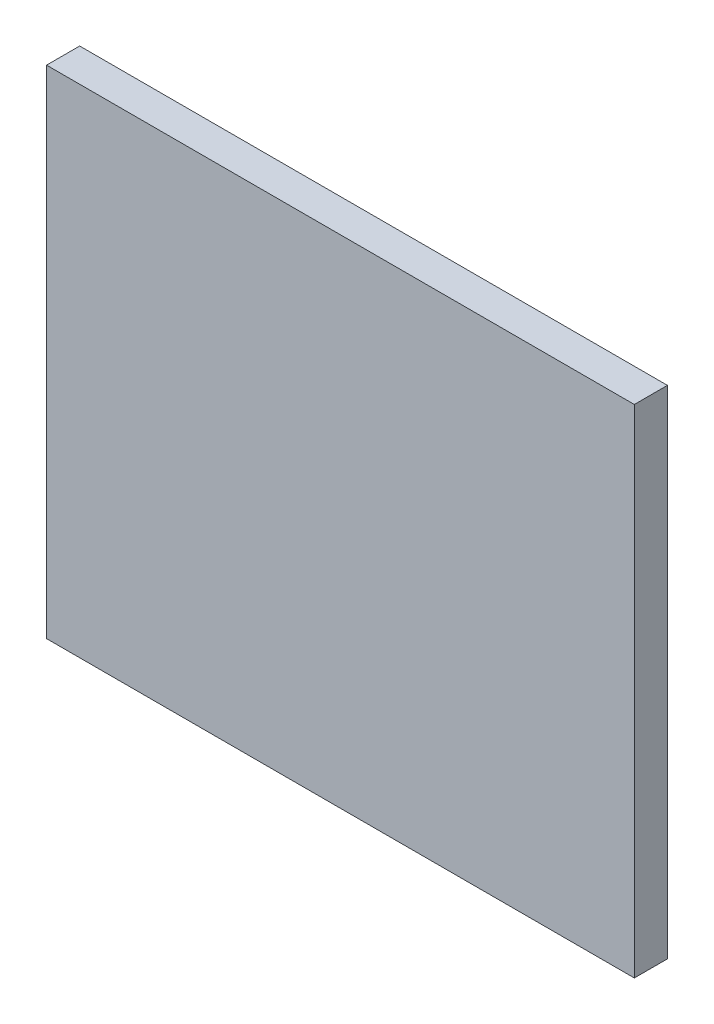
ISO-10303-21;
HEADER;
FILE_DESCRIPTION(('STEP AP214'),'2;1');
FILE_NAME('part.step','',(''),(''),'','','');
FILE_SCHEMA(('AUTOMOTIVE_DESIGN { 1 0 10303 214 1 1 1 1 }'));
ENDSEC;
DATA;
#1=APPLICATION_CONTEXT('core data for automotive mechanical design processes');
#2=APPLICATION_PROTOCOL_DEFINITION('international standard','automotive_design',2000,#1);
#3=PRODUCT_CONTEXT('',#1,'mechanical');
#4=PRODUCT('Part','Part','',(#3));
#5=PRODUCT_RELATED_PRODUCT_CATEGORY('part','',(#4));
#6=PRODUCT_DEFINITION_FORMATION('','',#4);
#7=PRODUCT_DEFINITION_CONTEXT('part definition',#1,'design');
#8=PRODUCT_DEFINITION('design','',#6,#7);
#9=PRODUCT_DEFINITION_SHAPE('','',#8);
#10=(LENGTH_UNIT() NAMED_UNIT(*) SI_UNIT(.MILLI.,.METRE.));
#11=(NAMED_UNIT(*) PLANE_ANGLE_UNIT() SI_UNIT($,.RADIAN.));
#12=(NAMED_UNIT(*) SI_UNIT($,.STERADIAN.) SOLID_ANGLE_UNIT());
#13=UNCERTAINTY_MEASURE_WITH_UNIT(LENGTH_MEASURE(1.E-05),#10,'distance_accuracy_value','');
#14=(GEOMETRIC_REPRESENTATION_CONTEXT(3) GLOBAL_UNCERTAINTY_ASSIGNED_CONTEXT((#13)) GLOBAL_UNIT_ASSIGNED_CONTEXT((#10,
#11,#12)) REPRESENTATION_CONTEXT('',''));
#15=CARTESIAN_POINT('',(0.,0.,0.));
#16=DIRECTION('',(0.,0.,1.));
#17=DIRECTION('',(1.,0.,0.));
#18=AXIS2_PLACEMENT_3D('',#15,#16,#17);
#19=CARTESIAN_POINT('',(0.,60.,0.));
#20=DIRECTION('',(1.,0.,0.));
#21=DIRECTION('',(0.,0.,-1.));
#22=AXIS2_PLACEMENT_3D('',#19,#20,#21);
#23=PLANE('',#22);
#24=DIRECTION('',(0.,0.,1.));
#25=VECTOR('',#24,1.);
#26=CARTESIAN_POINT('',(0.,0.,0.));
#27=LINE('',#26,#25);
#28=CARTESIAN_POINT('',(0.,0.,-4.));
#29=VERTEX_POINT('',#28);
#30=CARTESIAN_POINT('',(0.,0.,0.));
#31=VERTEX_POINT('',#30);
#32=EDGE_CURVE('E96',#29,#31,#27,.T.);
#33=ORIENTED_EDGE('',*,*,#32,.T.);
#34=DIRECTION('',(0.,-1.,0.));
#35=VECTOR('',#34,1.);
#36=CARTESIAN_POINT('',(0.,60.,0.));
#37=LINE('',#36,#35);
#38=CARTESIAN_POINT('',(0.,60.,0.));
#39=VERTEX_POINT('',#38);
#40=EDGE_CURVE('E11',#39,#31,#37,.T.);
#41=ORIENTED_EDGE('',*,*,#40,.F.);
#42=DIRECTION('',(0.,0.,1.));
#43=VECTOR('',#42,1.);
#44=CARTESIAN_POINT('',(0.,60.,0.));
#45=LINE('',#44,#43);
#46=CARTESIAN_POINT('',(0.,60.,-4.));
#47=VERTEX_POINT('',#46);
#48=EDGE_CURVE('E84',#47,#39,#45,.T.);
#49=ORIENTED_EDGE('',*,*,#48,.F.);
#50=DIRECTION('',(0.,-1.,0.));
#51=VECTOR('',#50,1.);
#52=CARTESIAN_POINT('',(0.,60.,-4.));
#53=LINE('',#52,#51);
#54=EDGE_CURVE('E92',#47,#29,#53,.T.);
#55=ORIENTED_EDGE('',*,*,#54,.T.);
#56=EDGE_LOOP('',(#33,#41,#49,#55));
#57=FACE_BOUND('',#56,.T.);
#58=ADVANCED_FACE('F33',(#57),#23,.F.);
#59=CARTESIAN_POINT('',(0.,60.,0.));
#60=DIRECTION('',(0.,0.,-1.));
#61=DIRECTION('',(-1.,0.,0.));
#62=AXIS2_PLACEMENT_3D('',#59,#60,#61);
#63=PLANE('',#62);
#64=DIRECTION('',(1.,0.,0.));
#65=VECTOR('',#64,1.);
#66=CARTESIAN_POINT('',(0.,0.,0.));
#67=LINE('',#66,#65);
#68=CARTESIAN_POINT('',(71.,0.,0.));
#69=VERTEX_POINT('',#68);
#70=EDGE_CURVE('E88',#31,#69,#67,.T.);
#71=ORIENTED_EDGE('',*,*,#70,.T.);
#72=DIRECTION('',(0.,-1.,0.));
#73=VECTOR('',#72,1.);
#74=CARTESIAN_POINT('',(71.,60.,0.));
#75=LINE('',#74,#73);
#76=CARTESIAN_POINT('',(71.,60.,0.));
#77=VERTEX_POINT('',#76);
#78=EDGE_CURVE('E41',#77,#69,#75,.T.);
#79=ORIENTED_EDGE('',*,*,#78,.F.);
#80=DIRECTION('',(1.,0.,0.));
#81=VECTOR('',#80,1.);
#82=CARTESIAN_POINT('',(0.,60.,0.));
#83=LINE('',#82,#81);
#84=EDGE_CURVE('E79',#39,#77,#83,.T.);
#85=ORIENTED_EDGE('',*,*,#84,.F.);
#86=ORIENTED_EDGE('',*,*,#40,.T.);
#87=EDGE_LOOP('',(#71,#79,#85,#86));
#88=FACE_BOUND('',#87,.T.);
#89=ADVANCED_FACE('F87',(#88),#63,.F.);
#90=CARTESIAN_POINT('',(71.,60.,0.));
#91=DIRECTION('',(-1.,0.,0.));
#92=DIRECTION('',(0.,0.,1.));
#93=AXIS2_PLACEMENT_3D('',#90,#91,#92);
#94=PLANE('',#93);
#95=DIRECTION('',(0.,0.,-1.));
#96=VECTOR('',#95,1.);
#97=CARTESIAN_POINT('',(71.,0.,0.));
#98=LINE('',#97,#96);
#99=CARTESIAN_POINT('',(71.,0.,-4.));
#100=VERTEX_POINT('',#99);
#101=EDGE_CURVE('E66',#69,#100,#98,.T.);
#102=ORIENTED_EDGE('',*,*,#101,.T.);
#103=DIRECTION('',(0.,-1.,0.));
#104=VECTOR('',#103,1.);
#105=CARTESIAN_POINT('',(71.,60.,-4.));
#106=LINE('',#105,#104);
#107=CARTESIAN_POINT('',(71.,60.,-4.));
#108=VERTEX_POINT('',#107);
#109=EDGE_CURVE('E89',#108,#100,#106,.T.);
#110=ORIENTED_EDGE('',*,*,#109,.F.);
#111=DIRECTION('',(0.,0.,-1.));
#112=VECTOR('',#111,1.);
#113=CARTESIAN_POINT('',(71.,60.,0.));
#114=LINE('',#113,#112);
#115=EDGE_CURVE('E82',#77,#108,#114,.T.);
#116=ORIENTED_EDGE('',*,*,#115,.F.);
#117=ORIENTED_EDGE('',*,*,#78,.T.);
#118=EDGE_LOOP('',(#102,#110,#116,#117));
#119=FACE_BOUND('',#118,.T.);
#120=ADVANCED_FACE('F90',(#119),#94,.F.);
#121=CARTESIAN_POINT('',(0.,60.,-4.));
#122=DIRECTION('',(0.,0.,1.));
#123=DIRECTION('',(1.,0.,0.));
#124=AXIS2_PLACEMENT_3D('',#121,#122,#123);
#125=PLANE('',#124);
#126=DIRECTION('',(-1.,0.,0.));
#127=VECTOR('',#126,1.);
#128=CARTESIAN_POINT('',(0.,0.,-4.));
#129=LINE('',#128,#127);
#130=EDGE_CURVE('E72',#100,#29,#129,.T.);
#131=ORIENTED_EDGE('',*,*,#130,.T.);
#132=ORIENTED_EDGE('',*,*,#54,.F.);
#133=DIRECTION('',(-1.,0.,0.));
#134=VECTOR('',#133,1.);
#135=CARTESIAN_POINT('',(0.,60.,-4.));
#136=LINE('',#135,#134);
#137=EDGE_CURVE('E49',#108,#47,#136,.T.);
#138=ORIENTED_EDGE('',*,*,#137,.F.);
#139=ORIENTED_EDGE('',*,*,#109,.T.);
#140=EDGE_LOOP('',(#131,#132,#138,#139));
#141=FACE_BOUND('',#140,.T.);
#142=ADVANCED_FACE('F103',(#141),#125,.F.);
#143=CARTESIAN_POINT('',(0.,60.,0.));
#144=DIRECTION('',(0.,-1.,0.));
#145=DIRECTION('',(0.,0.,-1.));
#146=AXIS2_PLACEMENT_3D('',#143,#144,#145);
#147=PLANE('',#146);
#148=ORIENTED_EDGE('',*,*,#48,.T.);
#149=ORIENTED_EDGE('',*,*,#84,.T.);
#150=ORIENTED_EDGE('',*,*,#115,.T.);
#151=ORIENTED_EDGE('',*,*,#137,.T.);
#152=EDGE_LOOP('',(#148,#149,#150,#151));
#153=FACE_BOUND('',#152,.T.);
#154=ADVANCED_FACE('F80',(#153),#147,.F.);
#155=CARTESIAN_POINT('',(0.,0.,0.));
#156=DIRECTION('',(0.,-1.,0.));
#157=DIRECTION('',(0.,0.,-1.));
#158=AXIS2_PLACEMENT_3D('',#155,#156,#157);
#159=PLANE('',#158);
#160=ORIENTED_EDGE('',*,*,#32,.F.);
#161=ORIENTED_EDGE('',*,*,#130,.F.);
#162=ORIENTED_EDGE('',*,*,#101,.F.);
#163=ORIENTED_EDGE('',*,*,#70,.F.);
#164=EDGE_LOOP('',(#160,#161,#162,#163));
#165=FACE_BOUND('',#164,.T.);
#166=ADVANCED_FACE('F106',(#165),#159,.T.);
#167=CLOSED_SHELL('',(#58,#89,#120,#142,#154,#166));
#168=MANIFOLD_SOLID_BREP('B2',#167);
#169=ADVANCED_BREP_SHAPE_REPRESENTATION('',(#18,#168),#14);
#170=SHAPE_DEFINITION_REPRESENTATION(#9,#169);
ENDSEC;
END-ISO-10303-21;
